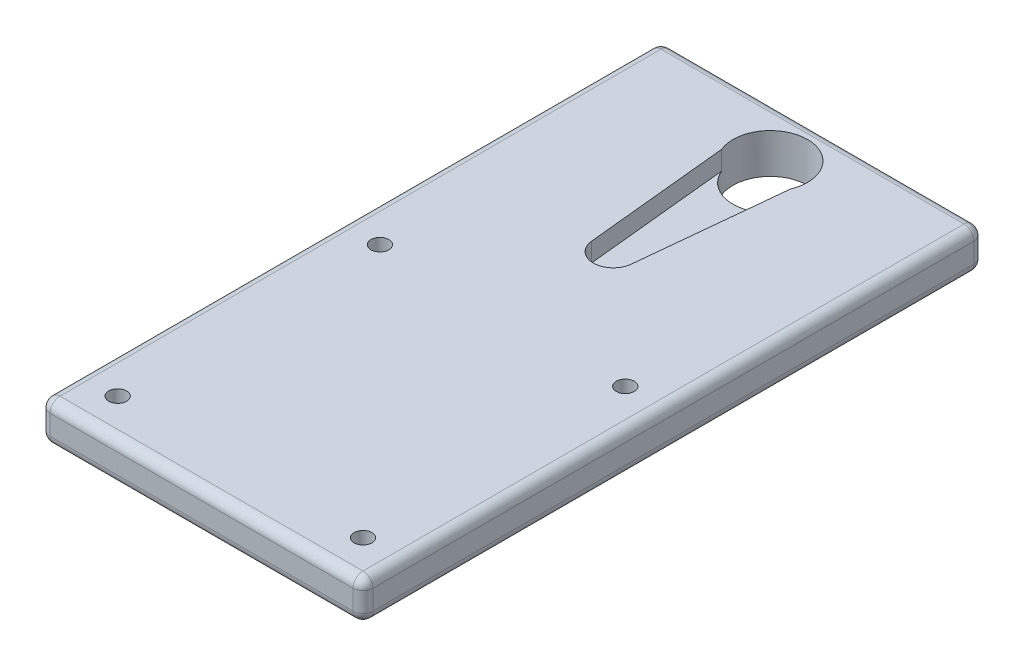
ISO-10303-21;
HEADER;
FILE_DESCRIPTION(('STEP AP214'),'2;1');
FILE_NAME('part.step','',(''),(''),'','','');
FILE_SCHEMA(('AUTOMOTIVE_DESIGN { 1 0 10303 214 1 1 1 1 }'));
ENDSEC;
DATA;
#1=APPLICATION_CONTEXT('core data for automotive mechanical design processes');
#2=APPLICATION_PROTOCOL_DEFINITION('international standard','automotive_design',2000,#1);
#3=PRODUCT_CONTEXT('',#1,'mechanical');
#4=PRODUCT('Part','Part','',(#3));
#5=PRODUCT_RELATED_PRODUCT_CATEGORY('part','',(#4));
#6=PRODUCT_DEFINITION_FORMATION('','',#4);
#7=PRODUCT_DEFINITION_CONTEXT('part definition',#1,'design');
#8=PRODUCT_DEFINITION('design','',#6,#7);
#9=PRODUCT_DEFINITION_SHAPE('','',#8);
#10=(LENGTH_UNIT() NAMED_UNIT(*) SI_UNIT(.MILLI.,.METRE.));
#11=(NAMED_UNIT(*) PLANE_ANGLE_UNIT() SI_UNIT($,.RADIAN.));
#12=(NAMED_UNIT(*) SI_UNIT($,.STERADIAN.) SOLID_ANGLE_UNIT());
#13=UNCERTAINTY_MEASURE_WITH_UNIT(LENGTH_MEASURE(1.E-05),#10,'distance_accuracy_value','');
#14=(GEOMETRIC_REPRESENTATION_CONTEXT(3) GLOBAL_UNCERTAINTY_ASSIGNED_CONTEXT((#13)) GLOBAL_UNIT_ASSIGNED_CONTEXT((#10,
#11,#12)) REPRESENTATION_CONTEXT('',''));
#15=CARTESIAN_POINT('',(0.,0.,0.));
#16=DIRECTION('',(0.,0.,1.));
#17=DIRECTION('',(1.,0.,0.));
#18=AXIS2_PLACEMENT_3D('',#15,#16,#17);
#19=CARTESIAN_POINT('',(-16.25,4.,-62.5));
#20=DIRECTION('',(1.,0.,0.));
#21=DIRECTION('',(0.,0.,-1.));
#22=AXIS2_PLACEMENT_3D('',#19,#20,#21);
#23=PLANE('',#22);
#24=DIRECTION('',(0.,0.,1.));
#25=VECTOR('',#24,1.);
#26=CARTESIAN_POINT('',(-16.25,1.,-62.5));
#27=LINE('',#26,#25);
#28=CARTESIAN_POINT('',(-16.25,1.,-61.5));
#29=VERTEX_POINT('',#28);
#30=CARTESIAN_POINT('',(-16.25,1.,-1.));
#31=VERTEX_POINT('',#30);
#32=EDGE_CURVE('E307',#29,#31,#27,.T.);
#33=ORIENTED_EDGE('',*,*,#32,.T.);
#34=DIRECTION('',(0.,-1.,0.));
#35=VECTOR('',#34,1.);
#36=CARTESIAN_POINT('',(-16.25,4.,-1.));
#37=LINE('',#36,#35);
#38=CARTESIAN_POINT('',(-16.25,3.,-1.));
#39=VERTEX_POINT('',#38);
#40=EDGE_CURVE('E311',#31,#39,#37,.F.);
#41=ORIENTED_EDGE('',*,*,#40,.T.);
#42=DIRECTION('',(0.,0.,1.));
#43=VECTOR('',#42,1.);
#44=CARTESIAN_POINT('',(-16.25,3.,-62.5));
#45=LINE('',#44,#43);
#46=CARTESIAN_POINT('',(-16.25,3.,-61.5));
#47=VERTEX_POINT('',#46);
#48=EDGE_CURVE('E304',#39,#47,#45,.F.);
#49=ORIENTED_EDGE('',*,*,#48,.T.);
#50=DIRECTION('',(0.,-1.,0.));
#51=VECTOR('',#50,1.);
#52=CARTESIAN_POINT('',(-16.25,4.,-61.5));
#53=LINE('',#52,#51);
#54=EDGE_CURVE('E301',#47,#29,#53,.T.);
#55=ORIENTED_EDGE('',*,*,#54,.T.);
#56=EDGE_LOOP('',(#33,#41,#49,#55));
#57=FACE_BOUND('',#56,.T.);
#58=ADVANCED_FACE('F44',(#57),#23,.F.);
#59=CARTESIAN_POINT('',(-16.25,4.,0.));
#60=DIRECTION('',(0.,0.,-1.));
#61=DIRECTION('',(-1.,0.,0.));
#62=AXIS2_PLACEMENT_3D('',#59,#60,#61);
#63=PLANE('',#62);
#64=DIRECTION('',(1.,0.,0.));
#65=VECTOR('',#64,1.);
#66=CARTESIAN_POINT('',(-16.25,1.,0.));
#67=LINE('',#66,#65);
#68=CARTESIAN_POINT('',(-15.25,1.,0.));
#69=VERTEX_POINT('',#68);
#70=CARTESIAN_POINT('',(15.25,1.,0.));
#71=VERTEX_POINT('',#70);
#72=EDGE_CURVE('E255',#69,#71,#67,.T.);
#73=ORIENTED_EDGE('',*,*,#72,.T.);
#74=DIRECTION('',(0.,-1.,0.));
#75=VECTOR('',#74,1.);
#76=CARTESIAN_POINT('',(15.25,4.,0.));
#77=LINE('',#76,#75);
#78=CARTESIAN_POINT('',(15.25,3.,0.));
#79=VERTEX_POINT('',#78);
#80=EDGE_CURVE('E259',#71,#79,#77,.F.);
#81=ORIENTED_EDGE('',*,*,#80,.T.);
#82=DIRECTION('',(1.,0.,0.));
#83=VECTOR('',#82,1.);
#84=CARTESIAN_POINT('',(-16.25,3.,0.));
#85=LINE('',#84,#83);
#86=CARTESIAN_POINT('',(-15.25,3.,0.));
#87=VERTEX_POINT('',#86);
#88=EDGE_CURVE('E252',#79,#87,#85,.F.);
#89=ORIENTED_EDGE('',*,*,#88,.T.);
#90=DIRECTION('',(0.,-1.,0.));
#91=VECTOR('',#90,1.);
#92=CARTESIAN_POINT('',(-15.25,4.,0.));
#93=LINE('',#92,#91);
#94=EDGE_CURVE('E249',#87,#69,#93,.T.);
#95=ORIENTED_EDGE('',*,*,#94,.T.);
#96=EDGE_LOOP('',(#73,#81,#89,#95));
#97=FACE_BOUND('',#96,.T.);
#98=ADVANCED_FACE('F456',(#97),#63,.F.);
#99=CARTESIAN_POINT('',(16.25,4.,-62.5));
#100=DIRECTION('',(-1.,0.,0.));
#101=DIRECTION('',(0.,0.,1.));
#102=AXIS2_PLACEMENT_3D('',#99,#100,#101);
#103=PLANE('',#102);
#104=DIRECTION('',(0.,0.,-1.));
#105=VECTOR('',#104,1.);
#106=CARTESIAN_POINT('',(16.25,3.,0.));
#107=LINE('',#106,#105);
#108=CARTESIAN_POINT('',(16.25,3.,-61.5));
#109=VERTEX_POINT('',#108);
#110=CARTESIAN_POINT('',(16.25,3.,-1.00000000000001));
#111=VERTEX_POINT('',#110);
#112=EDGE_CURVE('E278',#109,#111,#107,.F.);
#113=ORIENTED_EDGE('',*,*,#112,.T.);
#114=DIRECTION('',(0.,-1.,0.));
#115=VECTOR('',#114,1.);
#116=CARTESIAN_POINT('',(16.25,4.,-1.00000000000001));
#117=LINE('',#116,#115);
#118=CARTESIAN_POINT('',(16.25,1.,-1.00000000000001));
#119=VERTEX_POINT('',#118);
#120=EDGE_CURVE('E285',#111,#119,#117,.T.);
#121=ORIENTED_EDGE('',*,*,#120,.T.);
#122=DIRECTION('',(0.,0.,-1.));
#123=VECTOR('',#122,1.);
#124=CARTESIAN_POINT('',(16.25,1.,-62.5));
#125=LINE('',#124,#123);
#126=CARTESIAN_POINT('',(16.25,1.,-61.5));
#127=VERTEX_POINT('',#126);
#128=EDGE_CURVE('E281',#119,#127,#125,.T.);
#129=ORIENTED_EDGE('',*,*,#128,.T.);
#130=DIRECTION('',(0.,-1.,0.));
#131=VECTOR('',#130,1.);
#132=CARTESIAN_POINT('',(16.25,4.,-61.5));
#133=LINE('',#132,#131);
#134=EDGE_CURVE('E275',#127,#109,#133,.F.);
#135=ORIENTED_EDGE('',*,*,#134,.T.);
#136=EDGE_LOOP('',(#113,#121,#129,#135));
#137=FACE_BOUND('',#136,.T.);
#138=ADVANCED_FACE('F451',(#137),#103,.F.);
#139=CARTESIAN_POINT('',(-16.25,4.,-62.5));
#140=DIRECTION('',(0.,0.,1.));
#141=DIRECTION('',(1.,0.,0.));
#142=AXIS2_PLACEMENT_3D('',#139,#140,#141);
#143=PLANE('',#142);
#144=DIRECTION('',(-1.,0.,0.));
#145=VECTOR('',#144,1.);
#146=CARTESIAN_POINT('',(-16.25,1.,-62.5));
#147=LINE('',#146,#145);
#148=CARTESIAN_POINT('',(15.25,1.,-62.5));
#149=VERTEX_POINT('',#148);
#150=CARTESIAN_POINT('',(-15.25,1.,-62.5));
#151=VERTEX_POINT('',#150);
#152=EDGE_CURVE('E294',#149,#151,#147,.T.);
#153=ORIENTED_EDGE('',*,*,#152,.T.);
#154=DIRECTION('',(0.,-1.,0.));
#155=VECTOR('',#154,1.);
#156=CARTESIAN_POINT('',(-15.25,4.,-62.5));
#157=LINE('',#156,#155);
#158=CARTESIAN_POINT('',(-15.25,3.,-62.5));
#159=VERTEX_POINT('',#158);
#160=EDGE_CURVE('E298',#151,#159,#157,.F.);
#161=ORIENTED_EDGE('',*,*,#160,.T.);
#162=DIRECTION('',(-1.,0.,0.));
#163=VECTOR('',#162,1.);
#164=CARTESIAN_POINT('',(16.25,3.,-62.5));
#165=LINE('',#164,#163);
#166=CARTESIAN_POINT('',(15.25,3.,-62.5));
#167=VERTEX_POINT('',#166);
#168=EDGE_CURVE('E291',#159,#167,#165,.F.);
#169=ORIENTED_EDGE('',*,*,#168,.T.);
#170=DIRECTION('',(0.,-1.,0.));
#171=VECTOR('',#170,1.);
#172=CARTESIAN_POINT('',(15.25,4.,-62.5));
#173=LINE('',#172,#171);
#174=EDGE_CURVE('E288',#167,#149,#173,.T.);
#175=ORIENTED_EDGE('',*,*,#174,.T.);
#176=EDGE_LOOP('',(#153,#161,#169,#175));
#177=FACE_BOUND('',#176,.T.);
#178=ADVANCED_FACE('F443',(#177),#143,.F.);
#179=CARTESIAN_POINT('',(0.,4.,0.));
#180=DIRECTION('',(0.,1.,0.));
#181=DIRECTION('',(0.,0.,1.));
#182=AXIS2_PLACEMENT_3D('',#179,#180,#181);
#183=PLANE('',#182);
#184=DIRECTION('',(0.,0.,1.));
#185=VECTOR('',#184,1.);
#186=CARTESIAN_POINT('',(-15.25,4.,0.));
#187=LINE('',#186,#185);
#188=CARTESIAN_POINT('',(-15.25,4.,-61.5));
#189=VERTEX_POINT('',#188);
#190=CARTESIAN_POINT('',(-15.25,4.,-1.));
#191=VERTEX_POINT('',#190);
#192=EDGE_CURVE('E314',#189,#191,#187,.T.);
#193=ORIENTED_EDGE('',*,*,#192,.T.);
#194=DIRECTION('',(1.,0.,0.));
#195=VECTOR('',#194,1.);
#196=CARTESIAN_POINT('',(16.25,4.,-1.00000000000001));
#197=LINE('',#196,#195);
#198=CARTESIAN_POINT('',(15.25,4.,-1.00000000000001));
#199=VERTEX_POINT('',#198);
#200=EDGE_CURVE('E11',#191,#199,#197,.T.);
#201=ORIENTED_EDGE('',*,*,#200,.T.);
#202=DIRECTION('',(0.,0.,-1.));
#203=VECTOR('',#202,1.);
#204=CARTESIAN_POINT('',(15.25,4.,-62.5));
#205=LINE('',#204,#203);
#206=CARTESIAN_POINT('',(15.25,4.,-61.5));
#207=VERTEX_POINT('',#206);
#208=EDGE_CURVE('E54',#199,#207,#205,.T.);
#209=ORIENTED_EDGE('',*,*,#208,.T.);
#210=DIRECTION('',(-1.,0.,0.));
#211=VECTOR('',#210,1.);
#212=CARTESIAN_POINT('',(-16.25,4.,-61.5));
#213=LINE('',#212,#211);
#214=EDGE_CURVE('E317',#207,#189,#213,.T.);
#215=ORIENTED_EDGE('',*,*,#214,.T.);
#216=EDGE_LOOP('',(#193,#201,#209,#215));
#217=FACE_BOUND('',#216,.T.);
#218=CARTESIAN_POINT('',(12.35,4.,-3.9));
#219=DIRECTION('',(0.,-1.,0.));
#220=DIRECTION('',(0.,0.,1.));
#221=AXIS2_PLACEMENT_3D('',#218,#219,#220);
#222=CIRCLE('',#221,0.900000000000001);
#223=CARTESIAN_POINT('',(12.35,4.,-3.));
#224=VERTEX_POINT('',#223);
#225=EDGE_CURVE('E410',#224,#224,#222,.T.);
#226=ORIENTED_EDGE('',*,*,#225,.T.);
#227=EDGE_LOOP('',(#226));
#228=FACE_BOUND('',#227,.T.);
#229=CARTESIAN_POINT('',(12.35,4.,-30.3));
#230=DIRECTION('',(0.,-1.,0.));
#231=DIRECTION('',(0.,0.,1.));
#232=AXIS2_PLACEMENT_3D('',#229,#230,#231);
#233=CIRCLE('',#232,0.900000000000001);
#234=CARTESIAN_POINT('',(12.35,4.,-29.4));
#235=VERTEX_POINT('',#234);
#236=EDGE_CURVE('E417',#235,#235,#233,.T.);
#237=ORIENTED_EDGE('',*,*,#236,.T.);
#238=EDGE_LOOP('',(#237));
#239=FACE_BOUND('',#238,.T.);
#240=CARTESIAN_POINT('',(-12.35,4.,-30.3));
#241=DIRECTION('',(0.,-1.,0.));
#242=DIRECTION('',(0.,0.,-1.));
#243=AXIS2_PLACEMENT_3D('',#240,#241,#242);
#244=CIRCLE('',#243,0.900000000000001);
#245=CARTESIAN_POINT('',(-12.35,4.,-31.2));
#246=VERTEX_POINT('',#245);
#247=EDGE_CURVE('E423',#246,#246,#244,.T.);
#248=ORIENTED_EDGE('',*,*,#247,.T.);
#249=EDGE_LOOP('',(#248));
#250=FACE_BOUND('',#249,.T.);
#251=CARTESIAN_POINT('',(-12.35,4.,-3.9));
#252=DIRECTION('',(0.,-1.,0.));
#253=DIRECTION('',(0.,0.,-1.));
#254=AXIS2_PLACEMENT_3D('',#251,#252,#253);
#255=CIRCLE('',#254,0.9);
#256=CARTESIAN_POINT('',(-12.35,4.,-4.8));
#257=VERTEX_POINT('',#256);
#258=EDGE_CURVE('E174',#257,#257,#255,.T.);
#259=ORIENTED_EDGE('',*,*,#258,.T.);
#260=EDGE_LOOP('',(#259));
#261=FACE_BOUND('',#260,.T.);
#262=CARTESIAN_POINT('',(0.,4.,-57.25));
#263=DIRECTION('',(0.,1.,0.));
#264=DIRECTION('',(0.,0.,-1.));
#265=AXIS2_PLACEMENT_3D('',#262,#263,#264);
#266=CIRCLE('',#265,3.75);
#267=CARTESIAN_POINT('',(3.46455,4.,-55.8149413609542));
#268=VERTEX_POINT('',#267);
#269=CARTESIAN_POINT('',(-3.46455,4.,-55.8149413609542));
#270=VERTEX_POINT('',#269);
#271=EDGE_CURVE('E201',#268,#270,#266,.T.);
#272=ORIENTED_EDGE('',*,*,#271,.F.);
#273=DIRECTION('',(0.100048589097752,0.,-0.994982552520168));
#274=VECTOR('',#273,1.);
#275=CARTESIAN_POINT('',(3.46455,4.,-55.8149413609542));
#276=LINE('',#275,#274);
#277=CARTESIAN_POINT('',(2.,4.,-41.2500013609542));
#278=VERTEX_POINT('',#277);
#279=EDGE_CURVE('E181',#278,#268,#276,.T.);
#280=ORIENTED_EDGE('',*,*,#279,.F.);
#281=CARTESIAN_POINT('',(0.,4.,-41.4511075790368));
#282=DIRECTION('',(0.,1.,0.));
#283=DIRECTION('',(0.,0.,1.));
#284=AXIS2_PLACEMENT_3D('',#281,#282,#283);
#285=CIRCLE('',#284,2.01008549841828);
#286=CARTESIAN_POINT('',(-1.99999999999999,4.,-41.2500013609542));
#287=VERTEX_POINT('',#286);
#288=EDGE_CURVE('E208',#287,#278,#285,.T.);
#289=ORIENTED_EDGE('',*,*,#288,.F.);
#290=DIRECTION('',(0.100048589097752,0.,0.994982552520168));
#291=VECTOR('',#290,1.);
#292=CARTESIAN_POINT('',(-3.46455,4.,-55.8149413609542));
#293=LINE('',#292,#291);
#294=EDGE_CURVE('E204',#270,#287,#293,.T.);
#295=ORIENTED_EDGE('',*,*,#294,.F.);
#296=EDGE_LOOP('',(#272,#280,#289,#295));
#297=FACE_BOUND('',#296,.T.);
#298=ADVANCED_FACE('F440',(#217,#228,#239,#250,#261,#297),#183,.T.);
#299=CARTESIAN_POINT('',(0.,0.,0.));
#300=DIRECTION('',(0.,1.,0.));
#301=DIRECTION('',(0.,0.,1.));
#302=AXIS2_PLACEMENT_3D('',#299,#300,#301);
#303=PLANE('',#302);
#304=DIRECTION('',(0.,0.,-1.));
#305=VECTOR('',#304,1.);
#306=CARTESIAN_POINT('',(15.25,0.,0.));
#307=LINE('',#306,#305);
#308=CARTESIAN_POINT('',(15.25,0.,-61.5));
#309=VERTEX_POINT('',#308);
#310=CARTESIAN_POINT('',(15.25,0.,-1.00000000000001));
#311=VERTEX_POINT('',#310);
#312=EDGE_CURVE('E268',#309,#311,#307,.F.);
#313=ORIENTED_EDGE('',*,*,#312,.T.);
#314=DIRECTION('',(1.,0.,0.));
#315=VECTOR('',#314,1.);
#316=CARTESIAN_POINT('',(0.,0.,-1.));
#317=LINE('',#316,#315);
#318=CARTESIAN_POINT('',(-15.25,0.,-1.));
#319=VERTEX_POINT('',#318);
#320=EDGE_CURVE('E271',#311,#319,#317,.F.);
#321=ORIENTED_EDGE('',*,*,#320,.T.);
#322=DIRECTION('',(0.,0.,1.));
#323=VECTOR('',#322,1.);
#324=CARTESIAN_POINT('',(-15.25,0.,0.));
#325=LINE('',#324,#323);
#326=CARTESIAN_POINT('',(-15.25,0.,-61.5));
#327=VERTEX_POINT('',#326);
#328=EDGE_CURVE('E262',#319,#327,#325,.F.);
#329=ORIENTED_EDGE('',*,*,#328,.T.);
#330=DIRECTION('',(-1.,0.,0.));
#331=VECTOR('',#330,1.);
#332=CARTESIAN_POINT('',(0.,0.,-61.5));
#333=LINE('',#332,#331);
#334=EDGE_CURVE('E265',#327,#309,#333,.F.);
#335=ORIENTED_EDGE('',*,*,#334,.T.);
#336=EDGE_LOOP('',(#313,#321,#329,#335));
#337=FACE_BOUND('',#336,.T.);
#338=CARTESIAN_POINT('',(12.35,0.,-30.3));
#339=DIRECTION('',(0.,1.,0.));
#340=DIRECTION('',(0.,0.,1.));
#341=AXIS2_PLACEMENT_3D('',#338,#339,#340);
#342=CIRCLE('',#341,1.9);
#343=CARTESIAN_POINT('',(12.35,0.,-28.4));
#344=VERTEX_POINT('',#343);
#345=EDGE_CURVE('E233',#344,#344,#342,.T.);
#346=ORIENTED_EDGE('',*,*,#345,.T.);
#347=EDGE_LOOP('',(#346));
#348=FACE_BOUND('',#347,.T.);
#349=CARTESIAN_POINT('',(-12.35,0.,-30.3));
#350=DIRECTION('',(0.,1.,0.));
#351=DIRECTION('',(0.,0.,1.));
#352=AXIS2_PLACEMENT_3D('',#349,#350,#351);
#353=CIRCLE('',#352,1.9);
#354=CARTESIAN_POINT('',(-12.35,0.,-28.4));
#355=VERTEX_POINT('',#354);
#356=EDGE_CURVE('E229',#355,#355,#353,.T.);
#357=ORIENTED_EDGE('',*,*,#356,.T.);
#358=EDGE_LOOP('',(#357));
#359=FACE_BOUND('',#358,.T.);
#360=CARTESIAN_POINT('',(12.35,0.,-3.9));
#361=DIRECTION('',(0.,1.,0.));
#362=DIRECTION('',(0.,0.,1.));
#363=AXIS2_PLACEMENT_3D('',#360,#361,#362);
#364=CIRCLE('',#363,1.9);
#365=CARTESIAN_POINT('',(12.35,0.,-2.00000000000001));
#366=VERTEX_POINT('',#365);
#367=EDGE_CURVE('E225',#366,#366,#364,.T.);
#368=ORIENTED_EDGE('',*,*,#367,.T.);
#369=EDGE_LOOP('',(#368));
#370=FACE_BOUND('',#369,.T.);
#371=CARTESIAN_POINT('',(-12.35,0.,-3.9));
#372=DIRECTION('',(0.,1.,0.));
#373=DIRECTION('',(0.,0.,1.));
#374=AXIS2_PLACEMENT_3D('',#371,#372,#373);
#375=CIRCLE('',#374,1.90000000000001);
#376=CARTESIAN_POINT('',(-12.35,0.,-1.99999999999999));
#377=VERTEX_POINT('',#376);
#378=EDGE_CURVE('E221',#377,#377,#375,.T.);
#379=ORIENTED_EDGE('',*,*,#378,.T.);
#380=EDGE_LOOP('',(#379));
#381=FACE_BOUND('',#380,.T.);
#382=CARTESIAN_POINT('',(0.,0.,-57.25));
#383=DIRECTION('',(0.,1.,0.));
#384=DIRECTION('',(0.,0.,1.));
#385=AXIS2_PLACEMENT_3D('',#382,#383,#384);
#386=CIRCLE('',#385,3.75);
#387=CARTESIAN_POINT('',(0.,0.,-53.5));
#388=VERTEX_POINT('',#387);
#389=EDGE_CURVE('E173',#388,#388,#386,.T.);
#390=ORIENTED_EDGE('',*,*,#389,.T.);
#391=EDGE_LOOP('',(#390));
#392=FACE_BOUND('',#391,.T.);
#393=ADVANCED_FACE('F442',(#337,#348,#359,#370,#381,#392),#303,.F.);
#394=CARTESIAN_POINT('',(0.,2.1,-57.25));
#395=DIRECTION('',(0.,1.,0.));
#396=DIRECTION('',(0.,0.,1.));
#397=AXIS2_PLACEMENT_3D('',#394,#395,#396);
#398=CYLINDRICAL_SURFACE('',#397,3.75);
#399=ORIENTED_EDGE('',*,*,#271,.T.);
#400=DIRECTION('',(0.,1.,0.));
#401=VECTOR('',#400,1.);
#402=CARTESIAN_POINT('',(-3.46455,2.1,-55.8149413609542));
#403=LINE('',#402,#401);
#404=CARTESIAN_POINT('',(-3.46455,2.1,-55.8149413609542));
#405=VERTEX_POINT('',#404);
#406=EDGE_CURVE('E167',#405,#270,#403,.T.);
#407=ORIENTED_EDGE('',*,*,#406,.F.);
#408=CARTESIAN_POINT('',(0.,2.1,-57.25));
#409=DIRECTION('',(0.,1.,0.));
#410=DIRECTION('',(0.,0.,1.));
#411=AXIS2_PLACEMENT_3D('',#408,#409,#410);
#412=CIRCLE('',#411,3.75);
#413=CARTESIAN_POINT('',(3.46455,2.1,-55.8149413609542));
#414=VERTEX_POINT('',#413);
#415=EDGE_CURVE('E160',#405,#414,#412,.T.);
#416=ORIENTED_EDGE('',*,*,#415,.T.);
#417=DIRECTION('',(0.,1.,0.));
#418=VECTOR('',#417,1.);
#419=CARTESIAN_POINT('',(3.46455,2.1,-55.8149413609542));
#420=LINE('',#419,#418);
#421=EDGE_CURVE('E164',#414,#268,#420,.T.);
#422=ORIENTED_EDGE('',*,*,#421,.T.);
#423=EDGE_LOOP('',(#399,#407,#416,#422));
#424=FACE_BOUND('',#423,.T.);
#425=ORIENTED_EDGE('',*,*,#389,.F.);
#426=EDGE_LOOP('',(#425));
#427=FACE_BOUND('',#426,.T.);
#428=ADVANCED_FACE('F162',(#424,#427),#398,.F.);
#429=CARTESIAN_POINT('',(3.46455,2.1,-55.8149413609542));
#430=DIRECTION('',(0.994982552520168,0.,0.100048589097752));
#431=DIRECTION('',(0.100048589097752,0.,-0.994982552520168));
#432=AXIS2_PLACEMENT_3D('',#429,#430,#431);
#433=PLANE('',#432);
#434=ORIENTED_EDGE('',*,*,#279,.T.);
#435=ORIENTED_EDGE('',*,*,#421,.F.);
#436=DIRECTION('',(0.100048589097752,0.,-0.994982552520168));
#437=VECTOR('',#436,1.);
#438=CARTESIAN_POINT('',(3.46455,2.1,-55.8149413609542));
#439=LINE('',#438,#437);
#440=CARTESIAN_POINT('',(2.,2.1,-41.2500013609542));
#441=VERTEX_POINT('',#440);
#442=EDGE_CURVE('E179',#441,#414,#439,.T.);
#443=ORIENTED_EDGE('',*,*,#442,.F.);
#444=DIRECTION('',(0.,1.,0.));
#445=VECTOR('',#444,1.);
#446=CARTESIAN_POINT('',(2.,2.1,-41.2500013609542));
#447=LINE('',#446,#445);
#448=EDGE_CURVE('E185',#441,#278,#447,.T.);
#449=ORIENTED_EDGE('',*,*,#448,.T.);
#450=EDGE_LOOP('',(#434,#435,#443,#449));
#451=FACE_BOUND('',#450,.T.);
#452=ADVANCED_FACE('F178',(#451),#433,.F.);
#453=CARTESIAN_POINT('',(0.,2.1,-41.4511075790368));
#454=DIRECTION('',(0.,1.,0.));
#455=DIRECTION('',(0.,0.,1.));
#456=AXIS2_PLACEMENT_3D('',#453,#454,#455);
#457=CYLINDRICAL_SURFACE('',#456,2.01008549841828);
#458=ORIENTED_EDGE('',*,*,#288,.T.);
#459=ORIENTED_EDGE('',*,*,#448,.F.);
#460=CARTESIAN_POINT('',(0.,2.1,-41.4511075790368));
#461=DIRECTION('',(0.,1.,0.));
#462=DIRECTION('',(0.,0.,1.));
#463=AXIS2_PLACEMENT_3D('',#460,#461,#462);
#464=CIRCLE('',#463,2.01008549841828);
#465=CARTESIAN_POINT('',(-1.99999999999999,2.1,-41.2500013609542));
#466=VERTEX_POINT('',#465);
#467=EDGE_CURVE('E190',#466,#441,#464,.T.);
#468=ORIENTED_EDGE('',*,*,#467,.F.);
#469=DIRECTION('',(0.,1.,0.));
#470=VECTOR('',#469,1.);
#471=CARTESIAN_POINT('',(-1.99999999999999,2.1,-41.2500013609542));
#472=LINE('',#471,#470);
#473=EDGE_CURVE('E195',#466,#287,#472,.T.);
#474=ORIENTED_EDGE('',*,*,#473,.T.);
#475=EDGE_LOOP('',(#458,#459,#468,#474));
#476=FACE_BOUND('',#475,.T.);
#477=ADVANCED_FACE('F438',(#476),#457,.F.);
#478=CARTESIAN_POINT('',(-3.46455,2.1,-55.8149413609542));
#479=DIRECTION('',(-0.994982552520168,0.,0.100048589097752));
#480=DIRECTION('',(0.100048589097752,0.,0.994982552520168));
#481=AXIS2_PLACEMENT_3D('',#478,#479,#480);
#482=PLANE('',#481);
#483=ORIENTED_EDGE('',*,*,#294,.T.);
#484=ORIENTED_EDGE('',*,*,#473,.F.);
#485=DIRECTION('',(0.100048589097752,0.,0.994982552520168));
#486=VECTOR('',#485,1.);
#487=CARTESIAN_POINT('',(-3.46455,2.1,-55.8149413609542));
#488=LINE('',#487,#486);
#489=EDGE_CURVE('E197',#405,#466,#488,.T.);
#490=ORIENTED_EDGE('',*,*,#489,.F.);
#491=ORIENTED_EDGE('',*,*,#406,.T.);
#492=EDGE_LOOP('',(#483,#484,#490,#491));
#493=FACE_BOUND('',#492,.T.);
#494=ADVANCED_FACE('F434',(#493),#482,.F.);
#495=CARTESIAN_POINT('',(0.,2.1,-57.25));
#496=DIRECTION('',(0.,-1.,0.));
#497=DIRECTION('',(0.,0.,-1.));
#498=AXIS2_PLACEMENT_3D('',#495,#496,#497);
#499=PLANE('',#498);
#500=ORIENTED_EDGE('',*,*,#415,.F.);
#501=ORIENTED_EDGE('',*,*,#489,.T.);
#502=ORIENTED_EDGE('',*,*,#467,.T.);
#503=ORIENTED_EDGE('',*,*,#442,.T.);
#504=EDGE_LOOP('',(#500,#501,#502,#503));
#505=FACE_BOUND('',#504,.T.);
#506=ADVANCED_FACE('F188',(#505),#499,.F.);
#507=CARTESIAN_POINT('',(-12.35,4.,-3.9));
#508=DIRECTION('',(0.,-1.,0.));
#509=DIRECTION('',(0.,0.,-1.));
#510=AXIS2_PLACEMENT_3D('',#507,#508,#509);
#511=CYLINDRICAL_SURFACE('',#510,0.9);
#512=CARTESIAN_POINT('',(-12.35,1.,-3.9));
#513=DIRECTION('',(0.,1.,0.));
#514=DIRECTION('',(0.,0.,1.));
#515=AXIS2_PLACEMENT_3D('',#512,#513,#514);
#516=CIRCLE('',#515,0.9);
#517=CARTESIAN_POINT('',(-12.35,1.,-3.));
#518=VERTEX_POINT('',#517);
#519=EDGE_CURVE('E245',#518,#518,#516,.F.);
#520=ORIENTED_EDGE('',*,*,#519,.T.);
#521=EDGE_LOOP('',(#520));
#522=FACE_BOUND('',#521,.T.);
#523=ORIENTED_EDGE('',*,*,#258,.F.);
#524=EDGE_LOOP('',(#523));
#525=FACE_BOUND('',#524,.T.);
#526=ADVANCED_FACE('F630',(#522,#525),#511,.F.);
#527=CARTESIAN_POINT('',(-12.35,4.,-30.3));
#528=DIRECTION('',(0.,-1.,0.));
#529=DIRECTION('',(0.,0.,-1.));
#530=AXIS2_PLACEMENT_3D('',#527,#528,#529);
#531=CYLINDRICAL_SURFACE('',#530,0.900000000000001);
#532=CARTESIAN_POINT('',(-12.35,0.999999999999994,-30.3));
#533=DIRECTION('',(0.,1.,0.));
#534=DIRECTION('',(0.,0.,1.));
#535=AXIS2_PLACEMENT_3D('',#532,#533,#534);
#536=CIRCLE('',#535,0.900000000000001);
#537=CARTESIAN_POINT('',(-12.35,0.999999999999994,-29.4));
#538=VERTEX_POINT('',#537);
#539=EDGE_CURVE('E237',#538,#538,#536,.F.);
#540=ORIENTED_EDGE('',*,*,#539,.T.);
#541=EDGE_LOOP('',(#540));
#542=FACE_BOUND('',#541,.T.);
#543=ORIENTED_EDGE('',*,*,#247,.F.);
#544=EDGE_LOOP('',(#543));
#545=FACE_BOUND('',#544,.T.);
#546=ADVANCED_FACE('F633',(#542,#545),#531,.F.);
#547=CARTESIAN_POINT('',(12.35,4.,-30.3));
#548=DIRECTION('',(0.,-1.,0.));
#549=DIRECTION('',(0.,0.,-1.));
#550=AXIS2_PLACEMENT_3D('',#547,#548,#549);
#551=CYLINDRICAL_SURFACE('',#550,0.900000000000001);
#552=CARTESIAN_POINT('',(12.35,0.999999999999994,-30.3));
#553=DIRECTION('',(0.,1.,0.));
#554=DIRECTION('',(0.,0.,1.));
#555=AXIS2_PLACEMENT_3D('',#552,#553,#554);
#556=CIRCLE('',#555,0.900000000000001);
#557=CARTESIAN_POINT('',(12.35,0.999999999999994,-29.4));
#558=VERTEX_POINT('',#557);
#559=EDGE_CURVE('E184',#558,#558,#556,.F.);
#560=ORIENTED_EDGE('',*,*,#559,.T.);
#561=EDGE_LOOP('',(#560));
#562=FACE_BOUND('',#561,.T.);
#563=ORIENTED_EDGE('',*,*,#236,.F.);
#564=EDGE_LOOP('',(#563));
#565=FACE_BOUND('',#564,.T.);
#566=ADVANCED_FACE('F637',(#562,#565),#551,.F.);
#567=CARTESIAN_POINT('',(12.35,4.,-3.9));
#568=DIRECTION('',(0.,-1.,0.));
#569=DIRECTION('',(0.,0.,-1.));
#570=AXIS2_PLACEMENT_3D('',#567,#568,#569);
#571=CYLINDRICAL_SURFACE('',#570,0.900000000000001);
#572=CARTESIAN_POINT('',(12.35,0.999999999999994,-3.9));
#573=DIRECTION('',(0.,1.,0.));
#574=DIRECTION('',(0.,0.,1.));
#575=AXIS2_PLACEMENT_3D('',#572,#573,#574);
#576=CIRCLE('',#575,0.900000000000001);
#577=CARTESIAN_POINT('',(12.35,0.999999999999994,-3.));
#578=VERTEX_POINT('',#577);
#579=EDGE_CURVE('E241',#578,#578,#576,.F.);
#580=ORIENTED_EDGE('',*,*,#579,.T.);
#581=EDGE_LOOP('',(#580));
#582=FACE_BOUND('',#581,.T.);
#583=ORIENTED_EDGE('',*,*,#225,.F.);
#584=EDGE_LOOP('',(#583));
#585=FACE_BOUND('',#584,.T.);
#586=ADVANCED_FACE('F474',(#582,#585),#571,.F.);
#587=CARTESIAN_POINT('',(12.35,0.999999999999994,-30.3));
#588=DIRECTION('',(0.,-1.,0.));
#589=DIRECTION('',(0.,0.,-1.));
#590=AXIS2_PLACEMENT_3D('',#587,#588,#589);
#591=CONICAL_SURFACE('',#590,0.900000000000001,0.78539816339745);
#592=ORIENTED_EDGE('',*,*,#345,.F.);
#593=EDGE_LOOP('',(#592));
#594=FACE_BOUND('',#593,.T.);
#595=ORIENTED_EDGE('',*,*,#559,.F.);
#596=EDGE_LOOP('',(#595));
#597=FACE_BOUND('',#596,.T.);
#598=ADVANCED_FACE('F467',(#594,#597),#591,.F.);
#599=CARTESIAN_POINT('',(-12.35,0.999999999999994,-30.3));
#600=DIRECTION('',(0.,-1.,0.));
#601=DIRECTION('',(0.,0.,-1.));
#602=AXIS2_PLACEMENT_3D('',#599,#600,#601);
#603=CONICAL_SURFACE('',#602,0.900000000000001,0.78539816339745);
#604=ORIENTED_EDGE('',*,*,#356,.F.);
#605=EDGE_LOOP('',(#604));
#606=FACE_BOUND('',#605,.T.);
#607=ORIENTED_EDGE('',*,*,#539,.F.);
#608=EDGE_LOOP('',(#607));
#609=FACE_BOUND('',#608,.T.);
#610=ADVANCED_FACE('F473',(#606,#609),#603,.F.);
#611=CARTESIAN_POINT('',(12.35,0.999999999999994,-3.9));
#612=DIRECTION('',(0.,-1.,0.));
#613=DIRECTION('',(0.,0.,-1.));
#614=AXIS2_PLACEMENT_3D('',#611,#612,#613);
#615=CONICAL_SURFACE('',#614,0.900000000000001,0.78539816339745);
#616=ORIENTED_EDGE('',*,*,#367,.F.);
#617=EDGE_LOOP('',(#616));
#618=FACE_BOUND('',#617,.T.);
#619=ORIENTED_EDGE('',*,*,#579,.F.);
#620=EDGE_LOOP('',(#619));
#621=FACE_BOUND('',#620,.T.);
#622=ADVANCED_FACE('F481',(#618,#621),#615,.F.);
#623=CARTESIAN_POINT('',(-12.35,1.,-3.9));
#624=DIRECTION('',(0.,-1.,0.));
#625=DIRECTION('',(0.,0.,-1.));
#626=AXIS2_PLACEMENT_3D('',#623,#624,#625);
#627=CONICAL_SURFACE('',#626,0.9,0.78539816339745);
#628=ORIENTED_EDGE('',*,*,#378,.F.);
#629=EDGE_LOOP('',(#628));
#630=FACE_BOUND('',#629,.T.);
#631=ORIENTED_EDGE('',*,*,#519,.F.);
#632=EDGE_LOOP('',(#631));
#633=FACE_BOUND('',#632,.T.);
#634=ADVANCED_FACE('F488',(#630,#633),#627,.F.);
#635=CARTESIAN_POINT('',(0.,3.,-61.5));
#636=DIRECTION('',(1.,0.,0.));
#637=DIRECTION('',(0.,0.,-1.));
#638=AXIS2_PLACEMENT_3D('',#635,#636,#637);
#639=CYLINDRICAL_SURFACE('',#638,1.);
#640=CARTESIAN_POINT('',(-15.25,3.,-61.5));
#641=DIRECTION('',(-1.,0.,0.));
#642=DIRECTION('',(0.,0.,1.));
#643=AXIS2_PLACEMENT_3D('',#640,#641,#642);
#644=CIRCLE('',#643,1.);
#645=EDGE_CURVE('E48',#189,#159,#644,.T.);
#646=ORIENTED_EDGE('',*,*,#645,.F.);
#647=ORIENTED_EDGE('',*,*,#214,.F.);
#648=CARTESIAN_POINT('',(15.25,3.,-61.5));
#649=DIRECTION('',(1.,0.,0.));
#650=DIRECTION('',(0.,0.,-1.));
#651=AXIS2_PLACEMENT_3D('',#648,#649,#650);
#652=CIRCLE('',#651,1.);
#653=EDGE_CURVE('E401',#167,#207,#652,.T.);
#654=ORIENTED_EDGE('',*,*,#653,.F.);
#655=ORIENTED_EDGE('',*,*,#168,.F.);
#656=EDGE_LOOP('',(#646,#647,#654,#655));
#657=FACE_BOUND('',#656,.T.);
#658=ADVANCED_FACE('F46',(#657),#639,.T.);
#659=CARTESIAN_POINT('',(-15.25,3.,-61.5));
#660=DIRECTION('',(0.,0.,-1.));
#661=DIRECTION('',(-1.,0.,0.));
#662=AXIS2_PLACEMENT_3D('',#659,#660,#661);
#663=SPHERICAL_SURFACE('',#662,1.);
#664=CARTESIAN_POINT('',(-15.25,3.,-61.5));
#665=DIRECTION('',(0.,0.,-1.));
#666=DIRECTION('',(0.,1.,0.));
#667=AXIS2_PLACEMENT_3D('',#664,#665,#666);
#668=CIRCLE('',#667,1.);
#669=EDGE_CURVE('E394',#189,#47,#668,.F.);
#670=ORIENTED_EDGE('',*,*,#669,.F.);
#671=ORIENTED_EDGE('',*,*,#645,.T.);
#672=CARTESIAN_POINT('',(-15.25,3.,-61.5));
#673=DIRECTION('',(0.,1.,0.));
#674=DIRECTION('',(0.,0.,1.));
#675=AXIS2_PLACEMENT_3D('',#672,#673,#674);
#676=CIRCLE('',#675,1.);
#677=EDGE_CURVE('E398',#47,#159,#676,.F.);
#678=ORIENTED_EDGE('',*,*,#677,.F.);
#679=EDGE_LOOP('',(#670,#671,#678));
#680=FACE_BOUND('',#679,.T.);
#681=ADVANCED_FACE('F564',(#680),#663,.T.);
#682=CARTESIAN_POINT('',(15.25,3.,-61.5));
#683=DIRECTION('',(0.,1.,0.));
#684=DIRECTION('',(0.,0.,1.));
#685=AXIS2_PLACEMENT_3D('',#682,#683,#684);
#686=SPHERICAL_SURFACE('',#685,1.);
#687=CARTESIAN_POINT('',(15.25,3.,-61.5));
#688=DIRECTION('',(0.,1.,0.));
#689=DIRECTION('',(0.,0.,1.));
#690=AXIS2_PLACEMENT_3D('',#687,#688,#689);
#691=CIRCLE('',#690,1.);
#692=EDGE_CURVE('E386',#167,#109,#691,.F.);
#693=ORIENTED_EDGE('',*,*,#692,.F.);
#694=ORIENTED_EDGE('',*,*,#653,.T.);
#695=CARTESIAN_POINT('',(15.25,3.,-61.5));
#696=DIRECTION('',(0.,0.,-1.));
#697=DIRECTION('',(-1.,0.,0.));
#698=AXIS2_PLACEMENT_3D('',#695,#696,#697);
#699=CIRCLE('',#698,1.);
#700=EDGE_CURVE('E390',#109,#207,#699,.F.);
#701=ORIENTED_EDGE('',*,*,#700,.F.);
#702=EDGE_LOOP('',(#693,#694,#701));
#703=FACE_BOUND('',#702,.T.);
#704=ADVANCED_FACE('F561',(#703),#686,.T.);
#705=CARTESIAN_POINT('',(-15.25,4.,-61.5));
#706=DIRECTION('',(0.,-1.,0.));
#707=DIRECTION('',(0.,0.,-1.));
#708=AXIS2_PLACEMENT_3D('',#705,#706,#707);
#709=CYLINDRICAL_SURFACE('',#708,1.);
#710=ORIENTED_EDGE('',*,*,#677,.T.);
#711=ORIENTED_EDGE('',*,*,#160,.F.);
#712=CARTESIAN_POINT('',(-15.25,1.,-61.5));
#713=DIRECTION('',(0.,-1.,0.));
#714=DIRECTION('',(0.,0.,-1.));
#715=AXIS2_PLACEMENT_3D('',#712,#713,#714);
#716=CIRCLE('',#715,1.);
#717=EDGE_CURVE('E379',#29,#151,#716,.T.);
#718=ORIENTED_EDGE('',*,*,#717,.F.);
#719=ORIENTED_EDGE('',*,*,#54,.F.);
#720=EDGE_LOOP('',(#710,#711,#718,#719));
#721=FACE_BOUND('',#720,.T.);
#722=ADVANCED_FACE('F557',(#721),#709,.T.);
#723=CARTESIAN_POINT('',(-15.25,3.,0.));
#724=DIRECTION('',(0.,0.,-1.));
#725=DIRECTION('',(-1.,0.,0.));
#726=AXIS2_PLACEMENT_3D('',#723,#724,#725);
#727=CYLINDRICAL_SURFACE('',#726,1.);
#728=ORIENTED_EDGE('',*,*,#669,.T.);
#729=ORIENTED_EDGE('',*,*,#48,.F.);
#730=CARTESIAN_POINT('',(-15.25,3.,-1.));
#731=DIRECTION('',(0.,0.,1.));
#732=DIRECTION('',(1.,0.,0.));
#733=AXIS2_PLACEMENT_3D('',#730,#731,#732);
#734=CIRCLE('',#733,1.);
#735=EDGE_CURVE('E375',#191,#39,#734,.T.);
#736=ORIENTED_EDGE('',*,*,#735,.F.);
#737=ORIENTED_EDGE('',*,*,#192,.F.);
#738=EDGE_LOOP('',(#728,#729,#736,#737));
#739=FACE_BOUND('',#738,.T.);
#740=ADVANCED_FACE('F553',(#739),#727,.T.);
#741=CARTESIAN_POINT('',(0.,3.,-1.));
#742=DIRECTION('',(-1.,0.,0.));
#743=DIRECTION('',(0.,0.,1.));
#744=AXIS2_PLACEMENT_3D('',#741,#742,#743);
#745=CYLINDRICAL_SURFACE('',#744,1.);
#746=CARTESIAN_POINT('',(15.25,3.,-1.00000000000001));
#747=DIRECTION('',(1.,0.,0.));
#748=DIRECTION('',(0.,0.,-1.));
#749=AXIS2_PLACEMENT_3D('',#746,#747,#748);
#750=CIRCLE('',#749,1.);
#751=EDGE_CURVE('E368',#199,#79,#750,.T.);
#752=ORIENTED_EDGE('',*,*,#751,.F.);
#753=ORIENTED_EDGE('',*,*,#200,.F.);
#754=CARTESIAN_POINT('',(-15.25,3.,-1.));
#755=DIRECTION('',(-1.,0.,0.));
#756=DIRECTION('',(0.,0.,1.));
#757=AXIS2_PLACEMENT_3D('',#754,#755,#756);
#758=CIRCLE('',#757,1.);
#759=EDGE_CURVE('E371',#87,#191,#758,.T.);
#760=ORIENTED_EDGE('',*,*,#759,.F.);
#761=ORIENTED_EDGE('',*,*,#88,.F.);
#762=EDGE_LOOP('',(#752,#753,#760,#761));
#763=FACE_BOUND('',#762,.T.);
#764=ADVANCED_FACE('F549',(#763),#745,.T.);
#765=CARTESIAN_POINT('',(15.25,3.,0.));
#766=DIRECTION('',(0.,0.,1.));
#767=DIRECTION('',(1.,0.,0.));
#768=AXIS2_PLACEMENT_3D('',#765,#766,#767);
#769=CYLINDRICAL_SURFACE('',#768,1.);
#770=ORIENTED_EDGE('',*,*,#700,.T.);
#771=ORIENTED_EDGE('',*,*,#208,.F.);
#772=CARTESIAN_POINT('',(15.25,3.,-1.00000000000001));
#773=DIRECTION('',(0.,0.,1.));
#774=DIRECTION('',(0.,-1.,0.));
#775=AXIS2_PLACEMENT_3D('',#772,#773,#774);
#776=CIRCLE('',#775,1.);
#777=EDGE_CURVE('E62',#111,#199,#776,.T.);
#778=ORIENTED_EDGE('',*,*,#777,.F.);
#779=ORIENTED_EDGE('',*,*,#112,.F.);
#780=EDGE_LOOP('',(#770,#771,#778,#779));
#781=FACE_BOUND('',#780,.T.);
#782=ADVANCED_FACE('F545',(#781),#769,.T.);
#783=CARTESIAN_POINT('',(15.25,4.,-61.5));
#784=DIRECTION('',(0.,-1.,0.));
#785=DIRECTION('',(0.,0.,-1.));
#786=AXIS2_PLACEMENT_3D('',#783,#784,#785);
#787=CYLINDRICAL_SURFACE('',#786,1.);
#788=ORIENTED_EDGE('',*,*,#692,.T.);
#789=ORIENTED_EDGE('',*,*,#134,.F.);
#790=CARTESIAN_POINT('',(15.25,1.,-61.5));
#791=DIRECTION('',(0.,-1.,0.));
#792=DIRECTION('',(0.,0.,-1.));
#793=AXIS2_PLACEMENT_3D('',#790,#791,#792);
#794=CIRCLE('',#793,1.);
#795=EDGE_CURVE('E362',#149,#127,#794,.T.);
#796=ORIENTED_EDGE('',*,*,#795,.F.);
#797=ORIENTED_EDGE('',*,*,#174,.F.);
#798=EDGE_LOOP('',(#788,#789,#796,#797));
#799=FACE_BOUND('',#798,.T.);
#800=ADVANCED_FACE('F541',(#799),#787,.T.);
#801=CARTESIAN_POINT('',(-16.25,1.,-61.5));
#802=DIRECTION('',(-1.,0.,0.));
#803=DIRECTION('',(0.,0.,1.));
#804=AXIS2_PLACEMENT_3D('',#801,#802,#803);
#805=CYLINDRICAL_SURFACE('',#804,1.);
#806=CARTESIAN_POINT('',(-15.25,1.,-61.5));
#807=DIRECTION('',(-1.,0.,0.));
#808=DIRECTION('',(0.,0.,1.));
#809=AXIS2_PLACEMENT_3D('',#806,#807,#808);
#810=CIRCLE('',#809,1.);
#811=EDGE_CURVE('E382',#151,#327,#810,.T.);
#812=ORIENTED_EDGE('',*,*,#811,.F.);
#813=ORIENTED_EDGE('',*,*,#152,.F.);
#814=CARTESIAN_POINT('',(15.25,1.,-61.5));
#815=DIRECTION('',(1.,0.,0.));
#816=DIRECTION('',(0.,0.,-1.));
#817=AXIS2_PLACEMENT_3D('',#814,#815,#816);
#818=CIRCLE('',#817,1.);
#819=EDGE_CURVE('E358',#309,#149,#818,.T.);
#820=ORIENTED_EDGE('',*,*,#819,.F.);
#821=ORIENTED_EDGE('',*,*,#334,.F.);
#822=EDGE_LOOP('',(#812,#813,#820,#821));
#823=FACE_BOUND('',#822,.T.);
#824=ADVANCED_FACE('F537',(#823),#805,.T.);
#825=CARTESIAN_POINT('',(-15.25,1.,-61.5));
#826=DIRECTION('',(0.,0.,-1.));
#827=DIRECTION('',(-1.,0.,0.));
#828=AXIS2_PLACEMENT_3D('',#825,#826,#827);
#829=SPHERICAL_SURFACE('',#828,1.);
#830=ORIENTED_EDGE('',*,*,#717,.T.);
#831=ORIENTED_EDGE('',*,*,#811,.T.);
#832=CARTESIAN_POINT('',(-15.25,1.,-61.5));
#833=DIRECTION('',(0.,0.,-1.));
#834=DIRECTION('',(-1.,0.,0.));
#835=AXIS2_PLACEMENT_3D('',#832,#833,#834);
#836=CIRCLE('',#835,1.);
#837=EDGE_CURVE('E354',#29,#327,#836,.F.);
#838=ORIENTED_EDGE('',*,*,#837,.F.);
#839=EDGE_LOOP('',(#830,#831,#838));
#840=FACE_BOUND('',#839,.T.);
#841=ADVANCED_FACE('F533',(#840),#829,.T.);
#842=CARTESIAN_POINT('',(-15.25,3.,-1.));
#843=DIRECTION('',(0.,1.,0.));
#844=DIRECTION('',(0.,0.,1.));
#845=AXIS2_PLACEMENT_3D('',#842,#843,#844);
#846=SPHERICAL_SURFACE('',#845,1.);
#847=ORIENTED_EDGE('',*,*,#759,.T.);
#848=ORIENTED_EDGE('',*,*,#735,.T.);
#849=CARTESIAN_POINT('',(-15.25,3.,-1.));
#850=DIRECTION('',(0.,1.,0.));
#851=DIRECTION('',(0.,0.,1.));
#852=AXIS2_PLACEMENT_3D('',#849,#850,#851);
#853=CIRCLE('',#852,1.);
#854=EDGE_CURVE('E350',#87,#39,#853,.F.);
#855=ORIENTED_EDGE('',*,*,#854,.F.);
#856=EDGE_LOOP('',(#847,#848,#855));
#857=FACE_BOUND('',#856,.T.);
#858=ADVANCED_FACE('F530',(#857),#846,.T.);
#859=CARTESIAN_POINT('',(15.25,3.,-1.00000000000001));
#860=DIRECTION('',(0.,1.,0.));
#861=DIRECTION('',(0.,0.,1.));
#862=AXIS2_PLACEMENT_3D('',#859,#860,#861);
#863=SPHERICAL_SURFACE('',#862,1.);
#864=ORIENTED_EDGE('',*,*,#777,.T.);
#865=ORIENTED_EDGE('',*,*,#751,.T.);
#866=CARTESIAN_POINT('',(15.25,3.,-1.00000000000001));
#867=DIRECTION('',(0.,1.,0.));
#868=DIRECTION('',(0.,0.,1.));
#869=AXIS2_PLACEMENT_3D('',#866,#867,#868);
#870=CIRCLE('',#869,1.);
#871=EDGE_CURVE('E346',#111,#79,#870,.F.);
#872=ORIENTED_EDGE('',*,*,#871,.F.);
#873=EDGE_LOOP('',(#864,#865,#872));
#874=FACE_BOUND('',#873,.T.);
#875=ADVANCED_FACE('F526',(#874),#863,.T.);
#876=CARTESIAN_POINT('',(15.25,1.,-61.5));
#877=DIRECTION('',(0.,0.,-1.));
#878=DIRECTION('',(-1.,0.,0.));
#879=AXIS2_PLACEMENT_3D('',#876,#877,#878);
#880=SPHERICAL_SURFACE('',#879,1.);
#881=ORIENTED_EDGE('',*,*,#819,.T.);
#882=ORIENTED_EDGE('',*,*,#795,.T.);
#883=CARTESIAN_POINT('',(15.25,1.,-61.5));
#884=DIRECTION('',(0.,0.,-1.));
#885=DIRECTION('',(-1.,0.,0.));
#886=AXIS2_PLACEMENT_3D('',#883,#884,#885);
#887=CIRCLE('',#886,1.);
#888=EDGE_CURVE('E343',#309,#127,#887,.F.);
#889=ORIENTED_EDGE('',*,*,#888,.F.);
#890=EDGE_LOOP('',(#881,#882,#889));
#891=FACE_BOUND('',#890,.T.);
#892=ADVANCED_FACE('F522',(#891),#880,.T.);
#893=CARTESIAN_POINT('',(-15.25,1.,-62.5));
#894=DIRECTION('',(0.,0.,1.));
#895=DIRECTION('',(1.,0.,0.));
#896=AXIS2_PLACEMENT_3D('',#893,#894,#895);
#897=CYLINDRICAL_SURFACE('',#896,1.);
#898=ORIENTED_EDGE('',*,*,#837,.T.);
#899=ORIENTED_EDGE('',*,*,#328,.F.);
#900=CARTESIAN_POINT('',(-15.25,1.,-1.));
#901=DIRECTION('',(0.,0.,1.));
#902=DIRECTION('',(1.,0.,0.));
#903=AXIS2_PLACEMENT_3D('',#900,#901,#902);
#904=CIRCLE('',#903,1.);
#905=EDGE_CURVE('E339',#31,#319,#904,.T.);
#906=ORIENTED_EDGE('',*,*,#905,.F.);
#907=ORIENTED_EDGE('',*,*,#32,.F.);
#908=EDGE_LOOP('',(#898,#899,#906,#907));
#909=FACE_BOUND('',#908,.T.);
#910=ADVANCED_FACE('F518',(#909),#897,.T.);
#911=CARTESIAN_POINT('',(-15.25,4.,-1.));
#912=DIRECTION('',(0.,-1.,0.));
#913=DIRECTION('',(0.,0.,-1.));
#914=AXIS2_PLACEMENT_3D('',#911,#912,#913);
#915=CYLINDRICAL_SURFACE('',#914,1.);
#916=ORIENTED_EDGE('',*,*,#854,.T.);
#917=ORIENTED_EDGE('',*,*,#40,.F.);
#918=CARTESIAN_POINT('',(-15.25,1.,-1.));
#919=DIRECTION('',(0.,-1.,0.));
#920=DIRECTION('',(0.,0.,-1.));
#921=AXIS2_PLACEMENT_3D('',#918,#919,#920);
#922=CIRCLE('',#921,1.);
#923=EDGE_CURVE('E336',#69,#31,#922,.T.);
#924=ORIENTED_EDGE('',*,*,#923,.F.);
#925=ORIENTED_EDGE('',*,*,#94,.F.);
#926=EDGE_LOOP('',(#916,#917,#924,#925));
#927=FACE_BOUND('',#926,.T.);
#928=ADVANCED_FACE('F514',(#927),#915,.T.);
#929=CARTESIAN_POINT('',(15.25,4.,-1.00000000000001));
#930=DIRECTION('',(0.,-1.,0.));
#931=DIRECTION('',(0.,0.,-1.));
#932=AXIS2_PLACEMENT_3D('',#929,#930,#931);
#933=CYLINDRICAL_SURFACE('',#932,1.);
#934=ORIENTED_EDGE('',*,*,#871,.T.);
#935=ORIENTED_EDGE('',*,*,#80,.F.);
#936=CARTESIAN_POINT('',(15.25,1.,-1.00000000000001));
#937=DIRECTION('',(0.,-1.,0.));
#938=DIRECTION('',(0.,0.,-1.));
#939=AXIS2_PLACEMENT_3D('',#936,#937,#938);
#940=CIRCLE('',#939,1.);
#941=EDGE_CURVE('E332',#119,#71,#940,.T.);
#942=ORIENTED_EDGE('',*,*,#941,.F.);
#943=ORIENTED_EDGE('',*,*,#120,.F.);
#944=EDGE_LOOP('',(#934,#935,#942,#943));
#945=FACE_BOUND('',#944,.T.);
#946=ADVANCED_FACE('F510',(#945),#933,.T.);
#947=CARTESIAN_POINT('',(15.25,1.,-62.5));
#948=DIRECTION('',(0.,0.,-1.));
#949=DIRECTION('',(-1.,0.,0.));
#950=AXIS2_PLACEMENT_3D('',#947,#948,#949);
#951=CYLINDRICAL_SURFACE('',#950,1.);
#952=ORIENTED_EDGE('',*,*,#888,.T.);
#953=ORIENTED_EDGE('',*,*,#128,.F.);
#954=CARTESIAN_POINT('',(15.25,1.,-1.00000000000001));
#955=DIRECTION('',(0.,0.,1.));
#956=DIRECTION('',(1.,0.,0.));
#957=AXIS2_PLACEMENT_3D('',#954,#955,#956);
#958=CIRCLE('',#957,1.);
#959=EDGE_CURVE('E328',#311,#119,#958,.T.);
#960=ORIENTED_EDGE('',*,*,#959,.F.);
#961=ORIENTED_EDGE('',*,*,#312,.F.);
#962=EDGE_LOOP('',(#952,#953,#960,#961));
#963=FACE_BOUND('',#962,.T.);
#964=ADVANCED_FACE('F506',(#963),#951,.T.);
#965=CARTESIAN_POINT('',(-15.25,1.,-1.));
#966=DIRECTION('',(-1.,0.,0.));
#967=DIRECTION('',(0.,0.,1.));
#968=AXIS2_PLACEMENT_3D('',#965,#966,#967);
#969=SPHERICAL_SURFACE('',#968,1.);
#970=ORIENTED_EDGE('',*,*,#923,.T.);
#971=ORIENTED_EDGE('',*,*,#905,.T.);
#972=CARTESIAN_POINT('',(-15.25,1.,-1.));
#973=DIRECTION('',(-1.,0.,0.));
#974=DIRECTION('',(0.,0.,1.));
#975=AXIS2_PLACEMENT_3D('',#972,#973,#974);
#976=CIRCLE('',#975,1.);
#977=EDGE_CURVE('E325',#69,#319,#976,.F.);
#978=ORIENTED_EDGE('',*,*,#977,.F.);
#979=EDGE_LOOP('',(#970,#971,#978));
#980=FACE_BOUND('',#979,.T.);
#981=ADVANCED_FACE('F502',(#980),#969,.T.);
#982=CARTESIAN_POINT('',(15.25,1.,-1.00000000000001));
#983=DIRECTION('',(1.,0.,0.));
#984=DIRECTION('',(0.,0.,-1.));
#985=AXIS2_PLACEMENT_3D('',#982,#983,#984);
#986=SPHERICAL_SURFACE('',#985,1.);
#987=ORIENTED_EDGE('',*,*,#959,.T.);
#988=ORIENTED_EDGE('',*,*,#941,.T.);
#989=CARTESIAN_POINT('',(15.25,1.,-1.00000000000001));
#990=DIRECTION('',(1.,0.,0.));
#991=DIRECTION('',(0.,0.,-1.));
#992=AXIS2_PLACEMENT_3D('',#989,#990,#991);
#993=CIRCLE('',#992,1.);
#994=EDGE_CURVE('E322',#311,#71,#993,.F.);
#995=ORIENTED_EDGE('',*,*,#994,.F.);
#996=EDGE_LOOP('',(#987,#988,#995));
#997=FACE_BOUND('',#996,.T.);
#998=ADVANCED_FACE('F498',(#997),#986,.T.);
#999=CARTESIAN_POINT('',(-16.25,1.,-1.));
#1000=DIRECTION('',(1.,0.,0.));
#1001=DIRECTION('',(0.,0.,-1.));
#1002=AXIS2_PLACEMENT_3D('',#999,#1000,#1001);
#1003=CYLINDRICAL_SURFACE('',#1002,1.);
#1004=ORIENTED_EDGE('',*,*,#977,.T.);
#1005=ORIENTED_EDGE('',*,*,#320,.F.);
#1006=ORIENTED_EDGE('',*,*,#994,.T.);
#1007=ORIENTED_EDGE('',*,*,#72,.F.);
#1008=EDGE_LOOP('',(#1004,#1005,#1006,#1007));
#1009=FACE_BOUND('',#1008,.T.);
#1010=ADVANCED_FACE('F495',(#1009),#1003,.T.);
#1011=CLOSED_SHELL('',(#58,#98,#138,#178,#298,#393,#428,#452,#477,#494,#506,#526,#546,#566,#586,
#598,#610,#622,#634,#658,#681,#704,#722,#740,#764,#782,#800,#824,#841,#858,#875,#892,#910,#928,
#946,#964,#981,#998,#1010));
#1012=MANIFOLD_SOLID_BREP('B2',#1011);
#1013=ADVANCED_BREP_SHAPE_REPRESENTATION('',(#18,#1012),#14);
#1014=SHAPE_DEFINITION_REPRESENTATION(#9,#1013);
ENDSEC;
END-ISO-10303-21;
